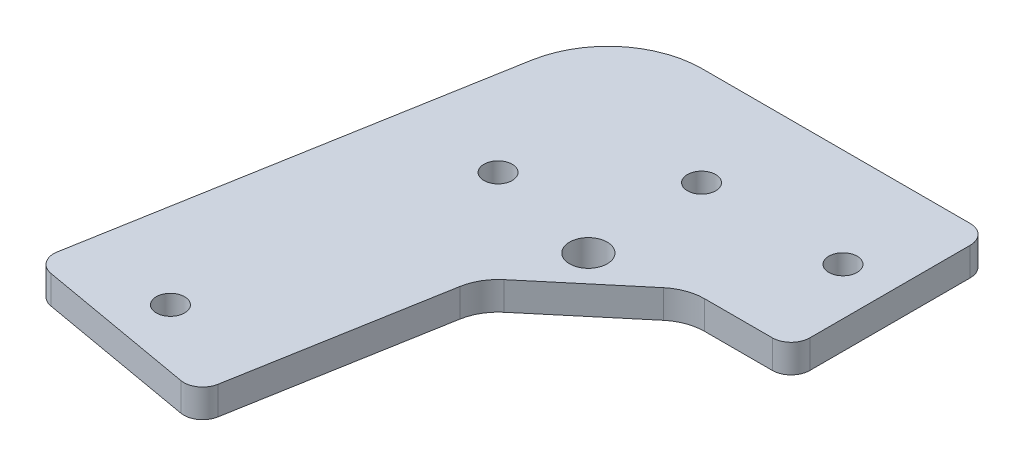
ISO-10303-21;
HEADER;
FILE_DESCRIPTION(('STEP AP214'),'2;1');
FILE_NAME('part.step','',(''),(''),'','','');
FILE_SCHEMA(('AUTOMOTIVE_DESIGN { 1 0 10303 214 1 1 1 1 }'));
ENDSEC;
DATA;
#1=APPLICATION_CONTEXT('core data for automotive mechanical design processes');
#2=APPLICATION_PROTOCOL_DEFINITION('international standard','automotive_design',2000,#1);
#3=PRODUCT_CONTEXT('',#1,'mechanical');
#4=PRODUCT('Part','Part','',(#3));
#5=PRODUCT_RELATED_PRODUCT_CATEGORY('part','',(#4));
#6=PRODUCT_DEFINITION_FORMATION('','',#4);
#7=PRODUCT_DEFINITION_CONTEXT('part definition',#1,'design');
#8=PRODUCT_DEFINITION('design','',#6,#7);
#9=PRODUCT_DEFINITION_SHAPE('','',#8);
#10=(LENGTH_UNIT() NAMED_UNIT(*) SI_UNIT(.MILLI.,.METRE.));
#11=(NAMED_UNIT(*) PLANE_ANGLE_UNIT() SI_UNIT($,.RADIAN.));
#12=(NAMED_UNIT(*) SI_UNIT($,.STERADIAN.) SOLID_ANGLE_UNIT());
#13=UNCERTAINTY_MEASURE_WITH_UNIT(LENGTH_MEASURE(1.E-05),#10,'distance_accuracy_value','');
#14=(GEOMETRIC_REPRESENTATION_CONTEXT(3) GLOBAL_UNCERTAINTY_ASSIGNED_CONTEXT((#13)) GLOBAL_UNIT_ASSIGNED_CONTEXT((#10,
#11,#12)) REPRESENTATION_CONTEXT('',''));
#15=CARTESIAN_POINT('',(0.,0.,0.));
#16=DIRECTION('',(0.,0.,1.));
#17=DIRECTION('',(1.,0.,0.));
#18=AXIS2_PLACEMENT_3D('',#15,#16,#17);
#19=CARTESIAN_POINT('',(-0.41954981558865,3.,-0.500000000000013));
#20=DIRECTION('',(0.,1.,0.));
#21=DIRECTION('',(0.,0.,1.));
#22=AXIS2_PLACEMENT_3D('',#19,#20,#21);
#23=PLANE('',#22);
#24=CARTESIAN_POINT('',(-1.73648177666934,3.,9.84807753012208));
#25=DIRECTION('',(0.,1.,0.));
#26=DIRECTION('',(0.,0.,1.));
#27=AXIS2_PLACEMENT_3D('',#24,#25,#26);
#28=CIRCLE('',#27,1.5);
#29=CARTESIAN_POINT('',(-1.73648177666934,3.,11.3480775301221));
#30=VERTEX_POINT('',#29);
#31=EDGE_CURVE('E488',#30,#30,#28,.T.);
#32=ORIENTED_EDGE('',*,*,#31,.F.);
#33=EDGE_LOOP('',(#32));
#34=FACE_BOUND('',#33,.T.);
#35=CARTESIAN_POINT('',(10.,3.,0.));
#36=DIRECTION('',(0.,1.,0.));
#37=DIRECTION('',(0.,0.,1.));
#38=AXIS2_PLACEMENT_3D('',#35,#36,#37);
#39=CIRCLE('',#38,1.5);
#40=CARTESIAN_POINT('',(10.,3.,1.5));
#41=VERTEX_POINT('',#40);
#42=EDGE_CURVE('E475',#41,#41,#39,.T.);
#43=ORIENTED_EDGE('',*,*,#42,.F.);
#44=EDGE_LOOP('',(#43));
#45=FACE_BOUND('',#44,.T.);
#46=DIRECTION('',(0.,0.,-1.));
#47=VECTOR('',#46,1.);
#48=CARTESIAN_POINT('',(30.,3.,10.5));
#49=LINE('',#48,#47);
#50=CARTESIAN_POINT('',(30.,3.,8.49999999999999));
#51=VERTEX_POINT('',#50);
#52=CARTESIAN_POINT('',(30.,3.,-8.50000000000001));
#53=VERTEX_POINT('',#52);
#54=EDGE_CURVE('E270',#51,#53,#49,.T.);
#55=ORIENTED_EDGE('',*,*,#54,.T.);
#56=CARTESIAN_POINT('',(28.,3.,-8.50000000000001));
#57=DIRECTION('',(0.,1.,0.));
#58=DIRECTION('',(0.,0.,1.));
#59=AXIS2_PLACEMENT_3D('',#56,#57,#58);
#60=CIRCLE('',#59,2.);
#61=CARTESIAN_POINT('',(28.,3.,-10.5));
#62=VERTEX_POINT('',#61);
#63=EDGE_CURVE('E186',#53,#62,#60,.T.);
#64=ORIENTED_EDGE('',*,*,#63,.T.);
#65=DIRECTION('',(-1.,0.,0.));
#66=VECTOR('',#65,1.);
#67=CARTESIAN_POINT('',(30.,3.,-10.5));
#68=LINE('',#67,#66);
#69=CARTESIAN_POINT('',(-0.41954981558864,3.,-10.5));
#70=VERTEX_POINT('',#69);
#71=EDGE_CURVE('E258',#62,#70,#68,.T.);
#72=ORIENTED_EDGE('',*,*,#71,.T.);
#73=CARTESIAN_POINT('',(-0.41954981558865,3.,-0.500000000000013));
#74=DIRECTION('',(0.,1.,0.));
#75=DIRECTION('',(0.,0.,1.));
#76=AXIS2_PLACEMENT_3D('',#73,#74,#75);
#77=CIRCLE('',#76,10.);
#78=CARTESIAN_POINT('',(-10.2676273457107,3.,-2.23648177666936));
#79=VERTEX_POINT('',#78);
#80=EDGE_CURVE('E255',#70,#79,#77,.T.);
#81=ORIENTED_EDGE('',*,*,#80,.T.);
#82=DIRECTION('',(-0.173648177666935,0.,0.984807753012207));
#83=VECTOR('',#82,1.);
#84=CARTESIAN_POINT('',(-10.2676273457107,3.,-2.23648177666936));
#85=LINE('',#84,#83);
#86=CARTESIAN_POINT('',(-17.8073530463064,3.,40.5234275140221));
#87=VERTEX_POINT('',#86);
#88=EDGE_CURVE('E254',#79,#87,#85,.T.);
#89=ORIENTED_EDGE('',*,*,#88,.T.);
#90=CARTESIAN_POINT('',(-15.837737540282,3.,40.870723869356));
#91=DIRECTION('',(0.,1.,0.));
#92=DIRECTION('',(0.,0.,1.));
#93=AXIS2_PLACEMENT_3D('',#90,#91,#92);
#94=CIRCLE('',#93,2.);
#95=CARTESIAN_POINT('',(-16.1850338956158,3.,42.8403393753804));
#96=VERTEX_POINT('',#95);
#97=EDGE_CURVE('E56',#87,#96,#94,.T.);
#98=ORIENTED_EDGE('',*,*,#97,.T.);
#99=DIRECTION('',(0.984807753012207,0.,0.173648177666934));
#100=VECTOR('',#99,1.);
#101=CARTESIAN_POINT('',(-18.1546494016403,3.,42.4930430200465));
#102=LINE('',#101,#100);
#103=CARTESIAN_POINT('',(0.556697905591676,3.,45.7923583957183));
#104=VERTEX_POINT('',#103);
#105=EDGE_CURVE('E197',#96,#104,#102,.T.);
#106=ORIENTED_EDGE('',*,*,#105,.T.);
#107=CARTESIAN_POINT('',(0.903994260925547,3.,43.8227428896938));
#108=DIRECTION('',(0.,1.,0.));
#109=DIRECTION('',(0.,0.,1.));
#110=AXIS2_PLACEMENT_3D('',#107,#108,#109);
#111=CIRCLE('',#110,2.);
#112=CARTESIAN_POINT('',(2.87360976694996,3.,44.1700392450277));
#113=VERTEX_POINT('',#112);
#114=EDGE_CURVE('E141',#104,#113,#111,.T.);
#115=ORIENTED_EDGE('',*,*,#114,.T.);
#116=DIRECTION('',(0.173648177666935,0.,-0.984807753012207));
#117=VECTOR('',#116,1.);
#118=CARTESIAN_POINT('',(6.72191593675263,3.,22.3452104279038));
#119=LINE('',#118,#117);
#120=CARTESIAN_POINT('',(6.72191593675264,3.,22.3452104279038));
#121=VERTEX_POINT('',#120);
#122=EDGE_CURVE('E134',#113,#121,#119,.T.);
#123=ORIENTED_EDGE('',*,*,#122,.T.);
#124=CARTESIAN_POINT('',(11.6459547018137,3.,23.2134513162384));
#125=DIRECTION('',(0.,-1.,0.));
#126=DIRECTION('',(0.,0.,1.));
#127=AXIS2_PLACEMENT_3D('',#124,#125,#126);
#128=CIRCLE('',#127,5.00000000000001);
#129=CARTESIAN_POINT('',(8.43201665338099,3.,19.3832291006436));
#130=VERTEX_POINT('',#129);
#131=EDGE_CURVE('E138',#121,#130,#128,.T.);
#132=ORIENTED_EDGE('',*,*,#131,.T.);
#133=DIRECTION('',(0.766044443118979,0.,-0.642787609686538));
#134=VECTOR('',#133,1.);
#135=CARTESIAN_POINT('',(17.6245499708087,3.,11.6697777844051));
#136=LINE('',#135,#134);
#137=CARTESIAN_POINT('',(17.6245499708087,3.,11.6697777844051));
#138=VERTEX_POINT('',#137);
#139=EDGE_CURVE('E155',#130,#138,#136,.T.);
#140=ORIENTED_EDGE('',*,*,#139,.T.);
#141=CARTESIAN_POINT('',(20.8384880192414,3.,15.5));
#142=DIRECTION('',(0.,-1.,0.));
#143=DIRECTION('',(0.,0.,1.));
#144=AXIS2_PLACEMENT_3D('',#141,#142,#143);
#145=CIRCLE('',#144,5.00000000000001);
#146=CARTESIAN_POINT('',(20.8384880192414,3.,10.5));
#147=VERTEX_POINT('',#146);
#148=EDGE_CURVE('E227',#138,#147,#145,.T.);
#149=ORIENTED_EDGE('',*,*,#148,.T.);
#150=DIRECTION('',(1.,0.,0.));
#151=VECTOR('',#150,1.);
#152=CARTESIAN_POINT('',(30.,3.,10.5));
#153=LINE('',#152,#151);
#154=CARTESIAN_POINT('',(28.,3.,10.5));
#155=VERTEX_POINT('',#154);
#156=EDGE_CURVE('E265',#147,#155,#153,.T.);
#157=ORIENTED_EDGE('',*,*,#156,.T.);
#158=CARTESIAN_POINT('',(28.,3.,8.49999999999999));
#159=DIRECTION('',(0.,1.,0.));
#160=DIRECTION('',(0.,0.,1.));
#161=AXIS2_PLACEMENT_3D('',#158,#159,#160);
#162=CIRCLE('',#161,2.);
#163=EDGE_CURVE('E184',#155,#51,#162,.T.);
#164=ORIENTED_EDGE('',*,*,#163,.T.);
#165=EDGE_LOOP('',(#55,#64,#72,#81,#89,#98,#106,#115,#123,#132,#140,#149,#157,#164));
#166=FACE_BOUND('',#165,.T.);
#167=CARTESIAN_POINT('',(25.,3.,0.));
#168=DIRECTION('',(0.,1.,0.));
#169=DIRECTION('',(0.,0.,1.));
#170=AXIS2_PLACEMENT_3D('',#167,#168,#169);
#171=CIRCLE('',#170,1.5);
#172=CARTESIAN_POINT('',(25.,3.,1.5));
#173=VERTEX_POINT('',#172);
#174=EDGE_CURVE('E262',#173,#173,#171,.T.);
#175=ORIENTED_EDGE('',*,*,#174,.F.);
#176=EDGE_LOOP('',(#175));
#177=FACE_BOUND('',#176,.T.);
#178=CARTESIAN_POINT('',(-6.94592710667737,3.,39.3923101204883));
#179=DIRECTION('',(0.,1.,0.));
#180=DIRECTION('',(0.,0.,1.));
#181=AXIS2_PLACEMENT_3D('',#178,#179,#180);
#182=CIRCLE('',#181,1.50000000000001);
#183=CARTESIAN_POINT('',(-6.94592710667737,3.,40.8923101204883));
#184=VERTEX_POINT('',#183);
#185=EDGE_CURVE('E483',#184,#184,#182,.T.);
#186=ORIENTED_EDGE('',*,*,#185,.F.);
#187=EDGE_LOOP('',(#186));
#188=FACE_BOUND('',#187,.T.);
#189=CARTESIAN_POINT('',(10.4571328733487,3.,12.4623256700484));
#190=DIRECTION('',(0.,1.,0.));
#191=DIRECTION('',(0.,0.,1.));
#192=AXIS2_PLACEMENT_3D('',#189,#190,#191);
#193=CIRCLE('',#192,2.);
#194=CARTESIAN_POINT('',(10.4571328733487,3.,14.4623256700484));
#195=VERTEX_POINT('',#194);
#196=EDGE_CURVE('E494',#195,#195,#193,.T.);
#197=ORIENTED_EDGE('',*,*,#196,.F.);
#198=EDGE_LOOP('',(#197));
#199=FACE_BOUND('',#198,.T.);
#200=ADVANCED_FACE('F35',(#34,#45,#166,#177,#188,#199),#23,.T.);
#201=CARTESIAN_POINT('',(-0.41954981558865,0.,-0.500000000000013));
#202=DIRECTION('',(0.,1.,0.));
#203=DIRECTION('',(0.,0.,1.));
#204=AXIS2_PLACEMENT_3D('',#201,#202,#203);
#205=PLANE('',#204);
#206=DIRECTION('',(-1.,0.,0.));
#207=VECTOR('',#206,1.);
#208=CARTESIAN_POINT('',(30.,0.,-10.5));
#209=LINE('',#208,#207);
#210=CARTESIAN_POINT('',(28.,0.,-10.5));
#211=VERTEX_POINT('',#210);
#212=CARTESIAN_POINT('',(-0.41954981558864,0.,-10.5));
#213=VERTEX_POINT('',#212);
#214=EDGE_CURVE('E243',#211,#213,#209,.T.);
#215=ORIENTED_EDGE('',*,*,#214,.F.);
#216=CARTESIAN_POINT('',(28.,0.,-8.50000000000001));
#217=DIRECTION('',(0.,1.,0.));
#218=DIRECTION('',(0.,0.,1.));
#219=AXIS2_PLACEMENT_3D('',#216,#217,#218);
#220=CIRCLE('',#219,2.);
#221=CARTESIAN_POINT('',(30.,0.,-8.50000000000001));
#222=VERTEX_POINT('',#221);
#223=EDGE_CURVE('E175',#211,#222,#220,.F.);
#224=ORIENTED_EDGE('',*,*,#223,.T.);
#225=DIRECTION('',(0.,0.,-1.));
#226=VECTOR('',#225,1.);
#227=CARTESIAN_POINT('',(30.,0.,10.5));
#228=LINE('',#227,#226);
#229=CARTESIAN_POINT('',(30.,0.,8.49999999999999));
#230=VERTEX_POINT('',#229);
#231=EDGE_CURVE('E235',#230,#222,#228,.T.);
#232=ORIENTED_EDGE('',*,*,#231,.F.);
#233=CARTESIAN_POINT('',(28.,0.,8.49999999999999));
#234=DIRECTION('',(0.,1.,0.));
#235=DIRECTION('',(0.,0.,1.));
#236=AXIS2_PLACEMENT_3D('',#233,#234,#235);
#237=CIRCLE('',#236,2.);
#238=CARTESIAN_POINT('',(28.,0.,10.5));
#239=VERTEX_POINT('',#238);
#240=EDGE_CURVE('E173',#230,#239,#237,.F.);
#241=ORIENTED_EDGE('',*,*,#240,.T.);
#242=DIRECTION('',(1.,0.,0.));
#243=VECTOR('',#242,1.);
#244=CARTESIAN_POINT('',(30.,0.,10.5));
#245=LINE('',#244,#243);
#246=CARTESIAN_POINT('',(20.8384880192414,0.,10.5));
#247=VERTEX_POINT('',#246);
#248=EDGE_CURVE('E233',#247,#239,#245,.T.);
#249=ORIENTED_EDGE('',*,*,#248,.F.);
#250=CARTESIAN_POINT('',(20.8384880192414,0.,15.5));
#251=DIRECTION('',(0.,-1.,0.));
#252=DIRECTION('',(0.,0.,1.));
#253=AXIS2_PLACEMENT_3D('',#250,#251,#252);
#254=CIRCLE('',#253,5.00000000000001);
#255=CARTESIAN_POINT('',(17.6245499708087,0.,11.6697777844051));
#256=VERTEX_POINT('',#255);
#257=EDGE_CURVE('E226',#256,#247,#254,.T.);
#258=ORIENTED_EDGE('',*,*,#257,.F.);
#259=DIRECTION('',(0.766044443118979,0.,-0.642787609686538));
#260=VECTOR('',#259,1.);
#261=CARTESIAN_POINT('',(17.6245499708087,0.,11.6697777844051));
#262=LINE('',#261,#260);
#263=CARTESIAN_POINT('',(8.43201665338099,0.,19.3832291006436));
#264=VERTEX_POINT('',#263);
#265=EDGE_CURVE('E231',#264,#256,#262,.T.);
#266=ORIENTED_EDGE('',*,*,#265,.F.);
#267=CARTESIAN_POINT('',(11.6459547018137,0.,23.2134513162384));
#268=DIRECTION('',(0.,-1.,0.));
#269=DIRECTION('',(0.,0.,1.));
#270=AXIS2_PLACEMENT_3D('',#267,#268,#269);
#271=CIRCLE('',#270,5.00000000000001);
#272=CARTESIAN_POINT('',(6.72191593675264,0.,22.3452104279038));
#273=VERTEX_POINT('',#272);
#274=EDGE_CURVE('E237',#273,#264,#271,.T.);
#275=ORIENTED_EDGE('',*,*,#274,.F.);
#276=DIRECTION('',(0.173648177666935,0.,-0.984807753012207));
#277=VECTOR('',#276,1.);
#278=CARTESIAN_POINT('',(6.72191593675263,0.,22.3452104279038));
#279=LINE('',#278,#277);
#280=CARTESIAN_POINT('',(2.87360976694996,0.,44.1700392450277));
#281=VERTEX_POINT('',#280);
#282=EDGE_CURVE('E159',#281,#273,#279,.T.);
#283=ORIENTED_EDGE('',*,*,#282,.F.);
#284=CARTESIAN_POINT('',(0.903994260925547,0.,43.8227428896938));
#285=DIRECTION('',(0.,1.,0.));
#286=DIRECTION('',(0.,0.,1.));
#287=AXIS2_PLACEMENT_3D('',#284,#285,#286);
#288=CIRCLE('',#287,2.);
#289=CARTESIAN_POINT('',(0.556697905591676,0.,45.7923583957183));
#290=VERTEX_POINT('',#289);
#291=EDGE_CURVE('E171',#281,#290,#288,.F.);
#292=ORIENTED_EDGE('',*,*,#291,.T.);
#293=DIRECTION('',(0.984807753012207,0.,0.173648177666934));
#294=VECTOR('',#293,1.);
#295=CARTESIAN_POINT('',(-18.1546494016403,0.,42.4930430200465));
#296=LINE('',#295,#294);
#297=CARTESIAN_POINT('',(-16.1850338956158,0.,42.8403393753804));
#298=VERTEX_POINT('',#297);
#299=EDGE_CURVE('E146',#298,#290,#296,.T.);
#300=ORIENTED_EDGE('',*,*,#299,.F.);
#301=CARTESIAN_POINT('',(-15.837737540282,0.,40.870723869356));
#302=DIRECTION('',(0.,1.,0.));
#303=DIRECTION('',(0.,0.,1.));
#304=AXIS2_PLACEMENT_3D('',#301,#302,#303);
#305=CIRCLE('',#304,2.);
#306=CARTESIAN_POINT('',(-17.8073530463064,0.,40.5234275140221));
#307=VERTEX_POINT('',#306);
#308=EDGE_CURVE('E164',#298,#307,#305,.F.);
#309=ORIENTED_EDGE('',*,*,#308,.T.);
#310=DIRECTION('',(-0.173648177666935,0.,0.984807753012207));
#311=VECTOR('',#310,1.);
#312=CARTESIAN_POINT('',(-10.2676273457107,0.,-2.23648177666936));
#313=LINE('',#312,#311);
#314=CARTESIAN_POINT('',(-10.2676273457107,0.,-2.23648177666936));
#315=VERTEX_POINT('',#314);
#316=EDGE_CURVE('E205',#315,#307,#313,.T.);
#317=ORIENTED_EDGE('',*,*,#316,.F.);
#318=CARTESIAN_POINT('',(-0.41954981558865,0.,-0.500000000000013));
#319=DIRECTION('',(0.,1.,0.));
#320=DIRECTION('',(0.,0.,1.));
#321=AXIS2_PLACEMENT_3D('',#318,#319,#320);
#322=CIRCLE('',#321,10.);
#323=EDGE_CURVE('E207',#213,#315,#322,.T.);
#324=ORIENTED_EDGE('',*,*,#323,.F.);
#325=EDGE_LOOP('',(#215,#224,#232,#241,#249,#258,#266,#275,#283,#292,#300,#309,#317,#324));
#326=FACE_BOUND('',#325,.T.);
#327=CARTESIAN_POINT('',(25.,0.,0.));
#328=DIRECTION('',(0.,1.,0.));
#329=DIRECTION('',(0.,0.,1.));
#330=AXIS2_PLACEMENT_3D('',#327,#328,#329);
#331=CIRCLE('',#330,1.5);
#332=CARTESIAN_POINT('',(25.,0.,1.5));
#333=VERTEX_POINT('',#332);
#334=EDGE_CURVE('E474',#333,#333,#331,.T.);
#335=ORIENTED_EDGE('',*,*,#334,.T.);
#336=EDGE_LOOP('',(#335));
#337=FACE_BOUND('',#336,.T.);
#338=CARTESIAN_POINT('',(10.,0.,0.));
#339=DIRECTION('',(0.,1.,0.));
#340=DIRECTION('',(0.,0.,1.));
#341=AXIS2_PLACEMENT_3D('',#338,#339,#340);
#342=CIRCLE('',#341,1.5);
#343=CARTESIAN_POINT('',(10.,0.,1.5));
#344=VERTEX_POINT('',#343);
#345=EDGE_CURVE('E479',#344,#344,#342,.T.);
#346=ORIENTED_EDGE('',*,*,#345,.T.);
#347=EDGE_LOOP('',(#346));
#348=FACE_BOUND('',#347,.T.);
#349=CARTESIAN_POINT('',(-6.94592710667737,0.,39.3923101204883));
#350=DIRECTION('',(0.,1.,0.));
#351=DIRECTION('',(0.,0.,1.));
#352=AXIS2_PLACEMENT_3D('',#349,#350,#351);
#353=CIRCLE('',#352,1.50000000000001);
#354=CARTESIAN_POINT('',(-6.94592710667737,0.,40.8923101204883));
#355=VERTEX_POINT('',#354);
#356=EDGE_CURVE('E485',#355,#355,#353,.T.);
#357=ORIENTED_EDGE('',*,*,#356,.T.);
#358=EDGE_LOOP('',(#357));
#359=FACE_BOUND('',#358,.T.);
#360=CARTESIAN_POINT('',(-1.73648177666934,0.,9.84807753012208));
#361=DIRECTION('',(0.,1.,0.));
#362=DIRECTION('',(0.,0.,1.));
#363=AXIS2_PLACEMENT_3D('',#360,#361,#362);
#364=CIRCLE('',#363,1.5);
#365=CARTESIAN_POINT('',(-1.73648177666934,0.,11.3480775301221));
#366=VERTEX_POINT('',#365);
#367=EDGE_CURVE('E491',#366,#366,#364,.T.);
#368=ORIENTED_EDGE('',*,*,#367,.T.);
#369=EDGE_LOOP('',(#368));
#370=FACE_BOUND('',#369,.T.);
#371=CARTESIAN_POINT('',(10.4571328733487,0.,12.4623256700484));
#372=DIRECTION('',(0.,1.,0.));
#373=DIRECTION('',(0.,0.,1.));
#374=AXIS2_PLACEMENT_3D('',#371,#372,#373);
#375=CIRCLE('',#374,2.);
#376=CARTESIAN_POINT('',(10.4571328733487,0.,14.4623256700484));
#377=VERTEX_POINT('',#376);
#378=EDGE_CURVE('E497',#377,#377,#375,.T.);
#379=ORIENTED_EDGE('',*,*,#378,.T.);
#380=EDGE_LOOP('',(#379));
#381=FACE_BOUND('',#380,.T.);
#382=ADVANCED_FACE('F201',(#326,#337,#348,#359,#370,#381),#205,.F.);
#383=CARTESIAN_POINT('',(6.72191593675263,3.,22.3452104279038));
#384=DIRECTION('',(-0.984807753012207,0.,-0.173648177666935));
#385=DIRECTION('',(-0.173648177666935,0.,0.984807753012207));
#386=AXIS2_PLACEMENT_3D('',#383,#384,#385);
#387=PLANE('',#386);
#388=ORIENTED_EDGE('',*,*,#122,.F.);
#389=DIRECTION('',(0.,-1.,0.));
#390=VECTOR('',#389,1.);
#391=CARTESIAN_POINT('',(2.87360976694996,3.,44.1700392450277));
#392=LINE('',#391,#390);
#393=EDGE_CURVE('E190',#113,#281,#392,.T.);
#394=ORIENTED_EDGE('',*,*,#393,.T.);
#395=ORIENTED_EDGE('',*,*,#282,.T.);
#396=DIRECTION('',(0.,-1.,0.));
#397=VECTOR('',#396,1.);
#398=CARTESIAN_POINT('',(6.72191593675264,3.,22.3452104279038));
#399=LINE('',#398,#397);
#400=EDGE_CURVE('E151',#121,#273,#399,.T.);
#401=ORIENTED_EDGE('',*,*,#400,.F.);
#402=EDGE_LOOP('',(#388,#394,#395,#401));
#403=FACE_BOUND('',#402,.T.);
#404=ADVANCED_FACE('F157',(#403),#387,.F.);
#405=CARTESIAN_POINT('',(11.6459547018137,3.,23.2134513162384));
#406=DIRECTION('',(0.,-1.,0.));
#407=DIRECTION('',(0.,0.,-1.));
#408=AXIS2_PLACEMENT_3D('',#405,#406,#407);
#409=CYLINDRICAL_SURFACE('',#408,5.00000000000001);
#410=ORIENTED_EDGE('',*,*,#274,.T.);
#411=DIRECTION('',(0.,-1.,0.));
#412=VECTOR('',#411,1.);
#413=CARTESIAN_POINT('',(8.43201665338099,3.,19.3832291006436));
#414=LINE('',#413,#412);
#415=EDGE_CURVE('E153',#130,#264,#414,.T.);
#416=ORIENTED_EDGE('',*,*,#415,.F.);
#417=ORIENTED_EDGE('',*,*,#131,.F.);
#418=ORIENTED_EDGE('',*,*,#400,.T.);
#419=EDGE_LOOP('',(#410,#416,#417,#418));
#420=FACE_BOUND('',#419,.T.);
#421=ADVANCED_FACE('F150',(#420),#409,.F.);
#422=CARTESIAN_POINT('',(17.6245499708087,3.,11.6697777844051));
#423=DIRECTION('',(-0.642787609686538,0.,-0.766044443118979));
#424=DIRECTION('',(-0.766044443118979,0.,0.642787609686538));
#425=AXIS2_PLACEMENT_3D('',#422,#423,#424);
#426=PLANE('',#425);
#427=ORIENTED_EDGE('',*,*,#265,.T.);
#428=DIRECTION('',(0.,-1.,0.));
#429=VECTOR('',#428,1.);
#430=CARTESIAN_POINT('',(17.6245499708087,3.,11.6697777844051));
#431=LINE('',#430,#429);
#432=EDGE_CURVE('E166',#138,#256,#431,.T.);
#433=ORIENTED_EDGE('',*,*,#432,.F.);
#434=ORIENTED_EDGE('',*,*,#139,.F.);
#435=ORIENTED_EDGE('',*,*,#415,.T.);
#436=EDGE_LOOP('',(#427,#433,#434,#435));
#437=FACE_BOUND('',#436,.T.);
#438=ADVANCED_FACE('F263',(#437),#426,.F.);
#439=CARTESIAN_POINT('',(20.8384880192414,3.,15.5));
#440=DIRECTION('',(0.,-1.,0.));
#441=DIRECTION('',(0.,0.,-1.));
#442=AXIS2_PLACEMENT_3D('',#439,#440,#441);
#443=CYLINDRICAL_SURFACE('',#442,5.00000000000001);
#444=ORIENTED_EDGE('',*,*,#257,.T.);
#445=DIRECTION('',(0.,-1.,0.));
#446=VECTOR('',#445,1.);
#447=CARTESIAN_POINT('',(20.8384880192414,3.,10.5));
#448=LINE('',#447,#446);
#449=EDGE_CURVE('E217',#147,#247,#448,.T.);
#450=ORIENTED_EDGE('',*,*,#449,.F.);
#451=ORIENTED_EDGE('',*,*,#148,.F.);
#452=ORIENTED_EDGE('',*,*,#432,.T.);
#453=EDGE_LOOP('',(#444,#450,#451,#452));
#454=FACE_BOUND('',#453,.T.);
#455=ADVANCED_FACE('F224',(#454),#443,.F.);
#456=CARTESIAN_POINT('',(30.,3.,10.5));
#457=DIRECTION('',(0.,0.,-1.));
#458=DIRECTION('',(-1.,0.,0.));
#459=AXIS2_PLACEMENT_3D('',#456,#457,#458);
#460=PLANE('',#459);
#461=ORIENTED_EDGE('',*,*,#248,.T.);
#462=DIRECTION('',(0.,-1.,0.));
#463=VECTOR('',#462,1.);
#464=CARTESIAN_POINT('',(28.,3.,10.5));
#465=LINE('',#464,#463);
#466=EDGE_CURVE('E188',#239,#155,#465,.F.);
#467=ORIENTED_EDGE('',*,*,#466,.T.);
#468=ORIENTED_EDGE('',*,*,#156,.F.);
#469=ORIENTED_EDGE('',*,*,#449,.T.);
#470=EDGE_LOOP('',(#461,#467,#468,#469));
#471=FACE_BOUND('',#470,.T.);
#472=ADVANCED_FACE('F323',(#471),#460,.F.);
#473=CARTESIAN_POINT('',(30.,3.,10.5));
#474=DIRECTION('',(-1.,0.,0.));
#475=DIRECTION('',(0.,0.,1.));
#476=AXIS2_PLACEMENT_3D('',#473,#474,#475);
#477=PLANE('',#476);
#478=ORIENTED_EDGE('',*,*,#231,.T.);
#479=DIRECTION('',(0.,-1.,0.));
#480=VECTOR('',#479,1.);
#481=CARTESIAN_POINT('',(30.,3.,-8.50000000000001));
#482=LINE('',#481,#480);
#483=EDGE_CURVE('E180',#222,#53,#482,.F.);
#484=ORIENTED_EDGE('',*,*,#483,.T.);
#485=ORIENTED_EDGE('',*,*,#54,.F.);
#486=DIRECTION('',(0.,-1.,0.));
#487=VECTOR('',#486,1.);
#488=CARTESIAN_POINT('',(30.,3.,8.49999999999999));
#489=LINE('',#488,#487);
#490=EDGE_CURVE('E177',#51,#230,#489,.T.);
#491=ORIENTED_EDGE('',*,*,#490,.T.);
#492=EDGE_LOOP('',(#478,#484,#485,#491));
#493=FACE_BOUND('',#492,.T.);
#494=ADVANCED_FACE('F280',(#493),#477,.F.);
#495=CARTESIAN_POINT('',(30.,3.,-10.5));
#496=DIRECTION('',(0.,0.,1.));
#497=DIRECTION('',(1.,0.,0.));
#498=AXIS2_PLACEMENT_3D('',#495,#496,#497);
#499=PLANE('',#498);
#500=ORIENTED_EDGE('',*,*,#71,.F.);
#501=DIRECTION('',(0.,-1.,0.));
#502=VECTOR('',#501,1.);
#503=CARTESIAN_POINT('',(28.,3.,-10.5));
#504=LINE('',#503,#502);
#505=EDGE_CURVE('E161',#62,#211,#504,.T.);
#506=ORIENTED_EDGE('',*,*,#505,.T.);
#507=ORIENTED_EDGE('',*,*,#214,.T.);
#508=DIRECTION('',(0.,-1.,0.));
#509=VECTOR('',#508,1.);
#510=CARTESIAN_POINT('',(-0.41954981558864,3.,-10.5));
#511=LINE('',#510,#509);
#512=EDGE_CURVE('E214',#70,#213,#511,.T.);
#513=ORIENTED_EDGE('',*,*,#512,.F.);
#514=EDGE_LOOP('',(#500,#506,#507,#513));
#515=FACE_BOUND('',#514,.T.);
#516=ADVANCED_FACE('F275',(#515),#499,.F.);
#517=CARTESIAN_POINT('',(-0.41954981558865,3.,-0.500000000000013));
#518=DIRECTION('',(0.,-1.,0.));
#519=DIRECTION('',(0.,0.,-1.));
#520=AXIS2_PLACEMENT_3D('',#517,#518,#519);
#521=CYLINDRICAL_SURFACE('',#520,10.);
#522=ORIENTED_EDGE('',*,*,#323,.T.);
#523=DIRECTION('',(0.,-1.,0.));
#524=VECTOR('',#523,1.);
#525=CARTESIAN_POINT('',(-10.2676273457107,3.,-2.23648177666936));
#526=LINE('',#525,#524);
#527=EDGE_CURVE('E211',#79,#315,#526,.T.);
#528=ORIENTED_EDGE('',*,*,#527,.F.);
#529=ORIENTED_EDGE('',*,*,#80,.F.);
#530=ORIENTED_EDGE('',*,*,#512,.T.);
#531=EDGE_LOOP('',(#522,#528,#529,#530));
#532=FACE_BOUND('',#531,.T.);
#533=ADVANCED_FACE('F247',(#532),#521,.T.);
#534=CARTESIAN_POINT('',(-10.2676273457107,3.,-2.23648177666936));
#535=DIRECTION('',(0.984807753012207,0.,0.173648177666935));
#536=DIRECTION('',(0.173648177666935,0.,-0.984807753012207));
#537=AXIS2_PLACEMENT_3D('',#534,#535,#536);
#538=PLANE('',#537);
#539=ORIENTED_EDGE('',*,*,#316,.T.);
#540=DIRECTION('',(0.,-1.,0.));
#541=VECTOR('',#540,1.);
#542=CARTESIAN_POINT('',(-17.8073530463064,3.,40.5234275140221));
#543=LINE('',#542,#541);
#544=EDGE_CURVE('E11',#307,#87,#543,.F.);
#545=ORIENTED_EDGE('',*,*,#544,.T.);
#546=ORIENTED_EDGE('',*,*,#88,.F.);
#547=ORIENTED_EDGE('',*,*,#527,.T.);
#548=EDGE_LOOP('',(#539,#545,#546,#547));
#549=FACE_BOUND('',#548,.T.);
#550=ADVANCED_FACE('F252',(#549),#538,.F.);
#551=CARTESIAN_POINT('',(-18.1546494016403,3.,42.4930430200465));
#552=DIRECTION('',(0.173648177666934,0.,-0.984807753012207));
#553=DIRECTION('',(-0.984807753012208,0.,-0.173648177666934));
#554=AXIS2_PLACEMENT_3D('',#551,#552,#553);
#555=PLANE('',#554);
#556=ORIENTED_EDGE('',*,*,#299,.T.);
#557=DIRECTION('',(0.,-1.,0.));
#558=VECTOR('',#557,1.);
#559=CARTESIAN_POINT('',(0.556697905591676,3.,45.7923583957183));
#560=LINE('',#559,#558);
#561=EDGE_CURVE('E43',#290,#104,#560,.F.);
#562=ORIENTED_EDGE('',*,*,#561,.T.);
#563=ORIENTED_EDGE('',*,*,#105,.F.);
#564=DIRECTION('',(0.,-1.,0.));
#565=VECTOR('',#564,1.);
#566=CARTESIAN_POINT('',(-16.1850338956158,3.,42.8403393753804));
#567=LINE('',#566,#565);
#568=EDGE_CURVE('E192',#96,#298,#567,.T.);
#569=ORIENTED_EDGE('',*,*,#568,.T.);
#570=EDGE_LOOP('',(#556,#562,#563,#569));
#571=FACE_BOUND('',#570,.T.);
#572=ADVANCED_FACE('F196',(#571),#555,.F.);
#573=CARTESIAN_POINT('',(25.,3.,0.));
#574=DIRECTION('',(0.,-1.,0.));
#575=DIRECTION('',(0.,0.,-1.));
#576=AXIS2_PLACEMENT_3D('',#573,#574,#575);
#577=CYLINDRICAL_SURFACE('',#576,1.5);
#578=ORIENTED_EDGE('',*,*,#174,.T.);
#579=EDGE_LOOP('',(#578));
#580=FACE_BOUND('',#579,.T.);
#581=ORIENTED_EDGE('',*,*,#334,.F.);
#582=EDGE_LOOP('',(#581));
#583=FACE_BOUND('',#582,.T.);
#584=ADVANCED_FACE('F310',(#580,#583),#577,.F.);
#585=CARTESIAN_POINT('',(10.,3.,0.));
#586=DIRECTION('',(0.,-1.,0.));
#587=DIRECTION('',(0.,0.,-1.));
#588=AXIS2_PLACEMENT_3D('',#585,#586,#587);
#589=CYLINDRICAL_SURFACE('',#588,1.5);
#590=ORIENTED_EDGE('',*,*,#42,.T.);
#591=EDGE_LOOP('',(#590));
#592=FACE_BOUND('',#591,.T.);
#593=ORIENTED_EDGE('',*,*,#345,.F.);
#594=EDGE_LOOP('',(#593));
#595=FACE_BOUND('',#594,.T.);
#596=ADVANCED_FACE('F404',(#592,#595),#589,.F.);
#597=CARTESIAN_POINT('',(-6.94592710667737,3.,39.3923101204883));
#598=DIRECTION('',(0.,-1.,0.));
#599=DIRECTION('',(0.,0.,-1.));
#600=AXIS2_PLACEMENT_3D('',#597,#598,#599);
#601=CYLINDRICAL_SURFACE('',#600,1.50000000000001);
#602=ORIENTED_EDGE('',*,*,#185,.T.);
#603=EDGE_LOOP('',(#602));
#604=FACE_BOUND('',#603,.T.);
#605=ORIENTED_EDGE('',*,*,#356,.F.);
#606=EDGE_LOOP('',(#605));
#607=FACE_BOUND('',#606,.T.);
#608=ADVANCED_FACE('F395',(#604,#607),#601,.F.);
#609=CARTESIAN_POINT('',(-1.73648177666934,3.,9.84807753012208));
#610=DIRECTION('',(0.,-1.,0.));
#611=DIRECTION('',(0.,0.,-1.));
#612=AXIS2_PLACEMENT_3D('',#609,#610,#611);
#613=CYLINDRICAL_SURFACE('',#612,1.5);
#614=ORIENTED_EDGE('',*,*,#31,.T.);
#615=EDGE_LOOP('',(#614));
#616=FACE_BOUND('',#615,.T.);
#617=ORIENTED_EDGE('',*,*,#367,.F.);
#618=EDGE_LOOP('',(#617));
#619=FACE_BOUND('',#618,.T.);
#620=ADVANCED_FACE('F295',(#616,#619),#613,.F.);
#621=CARTESIAN_POINT('',(10.4571328733487,3.,12.4623256700484));
#622=DIRECTION('',(0.,-1.,0.));
#623=DIRECTION('',(0.,0.,-1.));
#624=AXIS2_PLACEMENT_3D('',#621,#622,#623);
#625=CYLINDRICAL_SURFACE('',#624,2.);
#626=ORIENTED_EDGE('',*,*,#196,.T.);
#627=EDGE_LOOP('',(#626));
#628=FACE_BOUND('',#627,.T.);
#629=ORIENTED_EDGE('',*,*,#378,.F.);
#630=EDGE_LOOP('',(#629));
#631=FACE_BOUND('',#630,.T.);
#632=ADVANCED_FACE('F286',(#628,#631),#625,.F.);
#633=CARTESIAN_POINT('',(28.,3.,-8.50000000000001));
#634=DIRECTION('',(0.,-1.,0.));
#635=DIRECTION('',(0.,0.,-1.));
#636=AXIS2_PLACEMENT_3D('',#633,#634,#635);
#637=CYLINDRICAL_SURFACE('',#636,2.);
#638=ORIENTED_EDGE('',*,*,#63,.F.);
#639=ORIENTED_EDGE('',*,*,#483,.F.);
#640=ORIENTED_EDGE('',*,*,#223,.F.);
#641=ORIENTED_EDGE('',*,*,#505,.F.);
#642=EDGE_LOOP('',(#638,#639,#640,#641));
#643=FACE_BOUND('',#642,.T.);
#644=ADVANCED_FACE('F283',(#643),#637,.T.);
#645=CARTESIAN_POINT('',(28.,3.,8.49999999999999));
#646=DIRECTION('',(0.,-1.,0.));
#647=DIRECTION('',(0.,0.,-1.));
#648=AXIS2_PLACEMENT_3D('',#645,#646,#647);
#649=CYLINDRICAL_SURFACE('',#648,2.);
#650=ORIENTED_EDGE('',*,*,#163,.F.);
#651=ORIENTED_EDGE('',*,*,#466,.F.);
#652=ORIENTED_EDGE('',*,*,#240,.F.);
#653=ORIENTED_EDGE('',*,*,#490,.F.);
#654=EDGE_LOOP('',(#650,#651,#652,#653));
#655=FACE_BOUND('',#654,.T.);
#656=ADVANCED_FACE('F285',(#655),#649,.T.);
#657=CARTESIAN_POINT('',(0.903994260925547,3.,43.8227428896938));
#658=DIRECTION('',(0.,-1.,0.));
#659=DIRECTION('',(0.,0.,-1.));
#660=AXIS2_PLACEMENT_3D('',#657,#658,#659);
#661=CYLINDRICAL_SURFACE('',#660,2.);
#662=ORIENTED_EDGE('',*,*,#114,.F.);
#663=ORIENTED_EDGE('',*,*,#561,.F.);
#664=ORIENTED_EDGE('',*,*,#291,.F.);
#665=ORIENTED_EDGE('',*,*,#393,.F.);
#666=EDGE_LOOP('',(#662,#663,#664,#665));
#667=FACE_BOUND('',#666,.T.);
#668=ADVANCED_FACE('F292',(#667),#661,.T.);
#669=CARTESIAN_POINT('',(-15.837737540282,3.,40.870723869356));
#670=DIRECTION('',(0.,-1.,0.));
#671=DIRECTION('',(0.,0.,-1.));
#672=AXIS2_PLACEMENT_3D('',#669,#670,#671);
#673=CYLINDRICAL_SURFACE('',#672,2.);
#674=ORIENTED_EDGE('',*,*,#97,.F.);
#675=ORIENTED_EDGE('',*,*,#544,.F.);
#676=ORIENTED_EDGE('',*,*,#308,.F.);
#677=ORIENTED_EDGE('',*,*,#568,.F.);
#678=EDGE_LOOP('',(#674,#675,#676,#677));
#679=FACE_BOUND('',#678,.T.);
#680=ADVANCED_FACE('F37',(#679),#673,.T.);
#681=CLOSED_SHELL('',(#200,#382,#404,#421,#438,#455,#472,#494,#516,#533,#550,#572,#584,#596,
#608,#620,#632,#644,#656,#668,#680));
#682=MANIFOLD_SOLID_BREP('B2',#681);
#683=ADVANCED_BREP_SHAPE_REPRESENTATION('',(#18,#682),#14);
#684=SHAPE_DEFINITION_REPRESENTATION(#9,#683);
ENDSEC;
END-ISO-10303-21;
